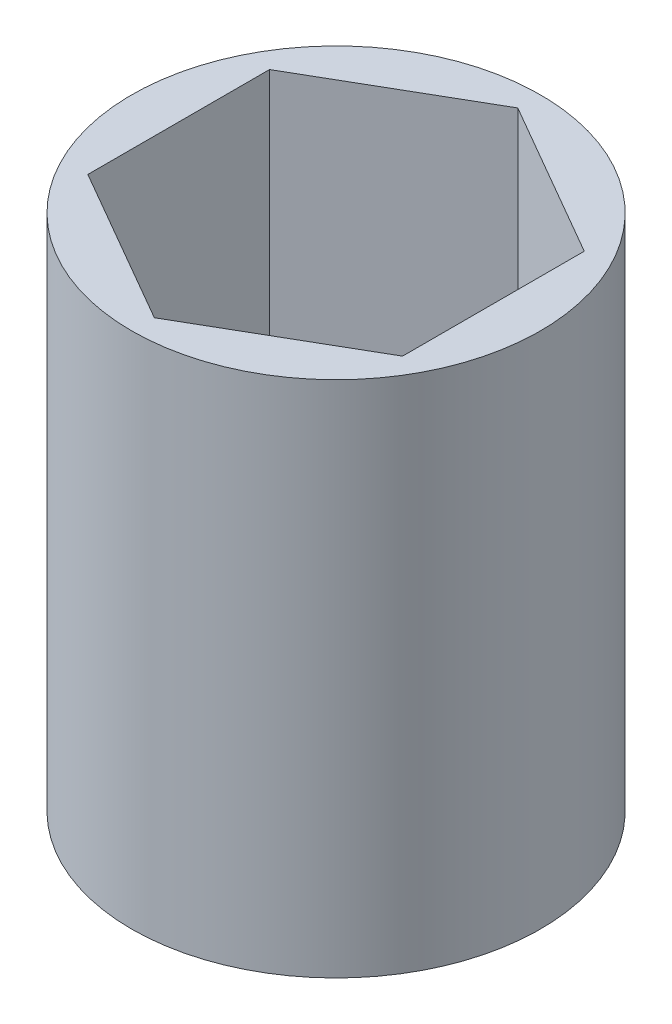
ISO-10303-21;
HEADER;
FILE_DESCRIPTION(('STEP AP214'),'2;1');
FILE_NAME('part.step','',(''),(''),'','','');
FILE_SCHEMA(('AUTOMOTIVE_DESIGN { 1 0 10303 214 1 1 1 1 }'));
ENDSEC;
DATA;
#1=APPLICATION_CONTEXT('core data for automotive mechanical design processes');
#2=APPLICATION_PROTOCOL_DEFINITION('international standard','automotive_design',2000,#1);
#3=PRODUCT_CONTEXT('',#1,'mechanical');
#4=PRODUCT('Part','Part','',(#3));
#5=PRODUCT_RELATED_PRODUCT_CATEGORY('part','',(#4));
#6=PRODUCT_DEFINITION_FORMATION('','',#4);
#7=PRODUCT_DEFINITION_CONTEXT('part definition',#1,'design');
#8=PRODUCT_DEFINITION('design','',#6,#7);
#9=PRODUCT_DEFINITION_SHAPE('','',#8);
#10=(LENGTH_UNIT() NAMED_UNIT(*) SI_UNIT(.MILLI.,.METRE.));
#11=(NAMED_UNIT(*) PLANE_ANGLE_UNIT() SI_UNIT($,.RADIAN.));
#12=(NAMED_UNIT(*) SI_UNIT($,.STERADIAN.) SOLID_ANGLE_UNIT());
#13=UNCERTAINTY_MEASURE_WITH_UNIT(LENGTH_MEASURE(1.E-05),#10,'distance_accuracy_value','');
#14=(GEOMETRIC_REPRESENTATION_CONTEXT(3) GLOBAL_UNCERTAINTY_ASSIGNED_CONTEXT((#13)) GLOBAL_UNIT_ASSIGNED_CONTEXT((#10,
#11,#12)) REPRESENTATION_CONTEXT('',''));
#15=CARTESIAN_POINT('',(0.,0.,0.));
#16=DIRECTION('',(0.,0.,1.));
#17=DIRECTION('',(1.,0.,0.));
#18=AXIS2_PLACEMENT_3D('',#15,#16,#17);
#19=CARTESIAN_POINT('',(0.,22.225,0.));
#20=DIRECTION('',(0.,1.,0.));
#21=DIRECTION('',(0.,0.,1.));
#22=AXIS2_PLACEMENT_3D('',#19,#20,#21);
#23=PLANE('',#22);
#24=CARTESIAN_POINT('',(0.,22.225,0.));
#25=DIRECTION('',(0.,1.,0.));
#26=DIRECTION('',(0.,0.,1.));
#27=AXIS2_PLACEMENT_3D('',#24,#25,#26);
#28=CIRCLE('',#27,8.76881679389313);
#29=CARTESIAN_POINT('',(0.,22.225,8.76881679389313));
#30=VERTEX_POINT('',#29);
#31=EDGE_CURVE('E11',#30,#30,#28,.T.);
#32=ORIENTED_EDGE('',*,*,#31,.T.);
#33=EDGE_LOOP('',(#32));
#34=FACE_BOUND('',#33,.T.);
#35=DIRECTION('',(-0.866025403784439,0.,0.5));
#36=VECTOR('',#35,1.);
#37=CARTESIAN_POINT('',(0.,22.225,-7.79422863405995));
#38=LINE('',#37,#36);
#39=CARTESIAN_POINT('',(0.,22.225,-7.79422863405995));
#40=VERTEX_POINT('',#39);
#41=CARTESIAN_POINT('',(-6.75,22.225,-3.89711431702997));
#42=VERTEX_POINT('',#41);
#43=EDGE_CURVE('E94',#40,#42,#38,.T.);
#44=ORIENTED_EDGE('',*,*,#43,.F.);
#45=DIRECTION('',(-0.866025403784439,0.,-0.5));
#46=VECTOR('',#45,1.);
#47=CARTESIAN_POINT('',(6.75,22.225,-3.89711431702997));
#48=LINE('',#47,#46);
#49=CARTESIAN_POINT('',(6.75,22.225,-3.89711431702997));
#50=VERTEX_POINT('',#49);
#51=EDGE_CURVE('E86',#50,#40,#48,.T.);
#52=ORIENTED_EDGE('',*,*,#51,.F.);
#53=DIRECTION('',(0.,0.,-1.));
#54=VECTOR('',#53,1.);
#55=CARTESIAN_POINT('',(6.75,22.225,3.89711431702997));
#56=LINE('',#55,#54);
#57=CARTESIAN_POINT('',(6.75,22.225,3.89711431702997));
#58=VERTEX_POINT('',#57);
#59=EDGE_CURVE('E114',#58,#50,#56,.T.);
#60=ORIENTED_EDGE('',*,*,#59,.F.);
#61=DIRECTION('',(0.866025403784439,0.,-0.5));
#62=VECTOR('',#61,1.);
#63=CARTESIAN_POINT('',(0.,22.225,7.79422863405995));
#64=LINE('',#63,#62);
#65=CARTESIAN_POINT('',(0.,22.225,7.79422863405995));
#66=VERTEX_POINT('',#65);
#67=EDGE_CURVE('E112',#66,#58,#64,.T.);
#68=ORIENTED_EDGE('',*,*,#67,.F.);
#69=DIRECTION('',(0.866025403784439,0.,0.5));
#70=VECTOR('',#69,1.);
#71=CARTESIAN_POINT('',(-6.75,22.225,3.89711431702997));
#72=LINE('',#71,#70);
#73=CARTESIAN_POINT('',(-6.75,22.225,3.89711431702997));
#74=VERTEX_POINT('',#73);
#75=EDGE_CURVE('E108',#74,#66,#72,.T.);
#76=ORIENTED_EDGE('',*,*,#75,.F.);
#77=DIRECTION('',(0.,0.,1.));
#78=VECTOR('',#77,1.);
#79=CARTESIAN_POINT('',(-6.75,22.225,-3.89711431702997));
#80=LINE('',#79,#78);
#81=EDGE_CURVE('E106',#42,#74,#80,.T.);
#82=ORIENTED_EDGE('',*,*,#81,.F.);
#83=EDGE_LOOP('',(#44,#52,#60,#68,#76,#82));
#84=FACE_BOUND('',#83,.T.);
#85=ADVANCED_FACE('F33',(#34,#84),#23,.T.);
#86=CARTESIAN_POINT('',(0.,0.,0.));
#87=DIRECTION('',(0.,1.,0.));
#88=DIRECTION('',(0.,0.,1.));
#89=AXIS2_PLACEMENT_3D('',#86,#87,#88);
#90=PLANE('',#89);
#91=CARTESIAN_POINT('',(0.,0.,0.));
#92=DIRECTION('',(0.,1.,0.));
#93=DIRECTION('',(0.,0.,1.));
#94=AXIS2_PLACEMENT_3D('',#91,#92,#93);
#95=CIRCLE('',#94,8.76881679389313);
#96=CARTESIAN_POINT('',(0.,0.,8.76881679389313));
#97=VERTEX_POINT('',#96);
#98=EDGE_CURVE('E37',#97,#97,#95,.T.);
#99=ORIENTED_EDGE('',*,*,#98,.F.);
#100=EDGE_LOOP('',(#99));
#101=FACE_BOUND('',#100,.T.);
#102=DIRECTION('',(-0.866025403784439,0.,-0.5));
#103=VECTOR('',#102,1.);
#104=CARTESIAN_POINT('',(6.75,0.,-3.89711431702997));
#105=LINE('',#104,#103);
#106=CARTESIAN_POINT('',(6.75,0.,-3.89711431702997));
#107=VERTEX_POINT('',#106);
#108=CARTESIAN_POINT('',(0.,0.,-7.79422863405995));
#109=VERTEX_POINT('',#108);
#110=EDGE_CURVE('E56',#107,#109,#105,.T.);
#111=ORIENTED_EDGE('',*,*,#110,.T.);
#112=DIRECTION('',(-0.866025403784439,0.,0.5));
#113=VECTOR('',#112,1.);
#114=CARTESIAN_POINT('',(0.,0.,-7.79422863405995));
#115=LINE('',#114,#113);
#116=CARTESIAN_POINT('',(-6.75,0.,-3.89711431702997));
#117=VERTEX_POINT('',#116);
#118=EDGE_CURVE('E101',#109,#117,#115,.T.);
#119=ORIENTED_EDGE('',*,*,#118,.T.);
#120=DIRECTION('',(0.,0.,1.));
#121=VECTOR('',#120,1.);
#122=CARTESIAN_POINT('',(-6.75,0.,-3.89711431702997));
#123=LINE('',#122,#121);
#124=CARTESIAN_POINT('',(-6.75,0.,3.89711431702997));
#125=VERTEX_POINT('',#124);
#126=EDGE_CURVE('E118',#117,#125,#123,.T.);
#127=ORIENTED_EDGE('',*,*,#126,.T.);
#128=DIRECTION('',(0.866025403784439,0.,0.5));
#129=VECTOR('',#128,1.);
#130=CARTESIAN_POINT('',(-6.75,0.,3.89711431702997));
#131=LINE('',#130,#129);
#132=CARTESIAN_POINT('',(0.,0.,7.79422863405995));
#133=VERTEX_POINT('',#132);
#134=EDGE_CURVE('E121',#125,#133,#131,.T.);
#135=ORIENTED_EDGE('',*,*,#134,.T.);
#136=DIRECTION('',(0.866025403784439,0.,-0.5));
#137=VECTOR('',#136,1.);
#138=CARTESIAN_POINT('',(0.,0.,7.79422863405995));
#139=LINE('',#138,#137);
#140=CARTESIAN_POINT('',(6.75,0.,3.89711431702997));
#141=VERTEX_POINT('',#140);
#142=EDGE_CURVE('E124',#133,#141,#139,.T.);
#143=ORIENTED_EDGE('',*,*,#142,.T.);
#144=DIRECTION('',(0.,0.,-1.));
#145=VECTOR('',#144,1.);
#146=CARTESIAN_POINT('',(6.75,0.,3.89711431702997));
#147=LINE('',#146,#145);
#148=EDGE_CURVE('E95',#141,#107,#147,.T.);
#149=ORIENTED_EDGE('',*,*,#148,.T.);
#150=EDGE_LOOP('',(#111,#119,#127,#135,#143,#149));
#151=FACE_BOUND('',#150,.T.);
#152=ADVANCED_FACE('F141',(#101,#151),#90,.F.);
#153=CARTESIAN_POINT('',(0.,22.225,0.));
#154=DIRECTION('',(0.,-1.,0.));
#155=DIRECTION('',(0.,0.,-1.));
#156=AXIS2_PLACEMENT_3D('',#153,#154,#155);
#157=CYLINDRICAL_SURFACE('',#156,8.76881679389313);
#158=ORIENTED_EDGE('',*,*,#31,.F.);
#159=EDGE_LOOP('',(#158));
#160=FACE_BOUND('',#159,.T.);
#161=ORIENTED_EDGE('',*,*,#98,.T.);
#162=EDGE_LOOP('',(#161));
#163=FACE_BOUND('',#162,.T.);
#164=ADVANCED_FACE('F35',(#160,#163),#157,.T.);
#165=CARTESIAN_POINT('',(6.75,22.225,-3.89711431702997));
#166=DIRECTION('',(-0.5,0.,0.866025403784438));
#167=DIRECTION('',(0.866025403784439,0.,0.5));
#168=AXIS2_PLACEMENT_3D('',#165,#166,#167);
#169=PLANE('',#168);
#170=ORIENTED_EDGE('',*,*,#110,.F.);
#171=DIRECTION('',(0.,-1.,0.));
#172=VECTOR('',#171,1.);
#173=CARTESIAN_POINT('',(6.75,22.225,-3.89711431702997));
#174=LINE('',#173,#172);
#175=EDGE_CURVE('E90',#50,#107,#174,.T.);
#176=ORIENTED_EDGE('',*,*,#175,.F.);
#177=ORIENTED_EDGE('',*,*,#51,.T.);
#178=DIRECTION('',(0.,-1.,0.));
#179=VECTOR('',#178,1.);
#180=CARTESIAN_POINT('',(0.,22.225,-7.79422863405995));
#181=LINE('',#180,#179);
#182=EDGE_CURVE('E89',#40,#109,#181,.T.);
#183=ORIENTED_EDGE('',*,*,#182,.T.);
#184=EDGE_LOOP('',(#170,#176,#177,#183));
#185=FACE_BOUND('',#184,.T.);
#186=ADVANCED_FACE('F88',(#185),#169,.T.);
#187=CARTESIAN_POINT('',(0.,22.225,-7.79422863405995));
#188=DIRECTION('',(0.5,0.,0.866025403784439));
#189=DIRECTION('',(0.866025403784439,0.,-0.5));
#190=AXIS2_PLACEMENT_3D('',#187,#188,#189);
#191=PLANE('',#190);
#192=ORIENTED_EDGE('',*,*,#118,.F.);
#193=ORIENTED_EDGE('',*,*,#182,.F.);
#194=ORIENTED_EDGE('',*,*,#43,.T.);
#195=DIRECTION('',(0.,-1.,0.));
#196=VECTOR('',#195,1.);
#197=CARTESIAN_POINT('',(-6.75,22.225,-3.89711431702997));
#198=LINE('',#197,#196);
#199=EDGE_CURVE('E102',#42,#117,#198,.T.);
#200=ORIENTED_EDGE('',*,*,#199,.T.);
#201=EDGE_LOOP('',(#192,#193,#194,#200));
#202=FACE_BOUND('',#201,.T.);
#203=ADVANCED_FACE('F98',(#202),#191,.T.);
#204=CARTESIAN_POINT('',(-6.75,22.225,-3.89711431702997));
#205=DIRECTION('',(1.,0.,0.));
#206=DIRECTION('',(0.,0.,-1.));
#207=AXIS2_PLACEMENT_3D('',#204,#205,#206);
#208=PLANE('',#207);
#209=ORIENTED_EDGE('',*,*,#126,.F.);
#210=ORIENTED_EDGE('',*,*,#199,.F.);
#211=ORIENTED_EDGE('',*,*,#81,.T.);
#212=DIRECTION('',(0.,-1.,0.));
#213=VECTOR('',#212,1.);
#214=CARTESIAN_POINT('',(-6.75,22.225,3.89711431702997));
#215=LINE('',#214,#213);
#216=EDGE_CURVE('E133',#74,#125,#215,.T.);
#217=ORIENTED_EDGE('',*,*,#216,.T.);
#218=EDGE_LOOP('',(#209,#210,#211,#217));
#219=FACE_BOUND('',#218,.T.);
#220=ADVANCED_FACE('F137',(#219),#208,.T.);
#221=CARTESIAN_POINT('',(-6.75,22.225,3.89711431702997));
#222=DIRECTION('',(0.5,0.,-0.866025403784438));
#223=DIRECTION('',(-0.866025403784439,0.,-0.5));
#224=AXIS2_PLACEMENT_3D('',#221,#222,#223);
#225=PLANE('',#224);
#226=ORIENTED_EDGE('',*,*,#134,.F.);
#227=ORIENTED_EDGE('',*,*,#216,.F.);
#228=ORIENTED_EDGE('',*,*,#75,.T.);
#229=DIRECTION('',(0.,-1.,0.));
#230=VECTOR('',#229,1.);
#231=CARTESIAN_POINT('',(0.,22.225,7.79422863405995));
#232=LINE('',#231,#230);
#233=EDGE_CURVE('E131',#66,#133,#232,.T.);
#234=ORIENTED_EDGE('',*,*,#233,.T.);
#235=EDGE_LOOP('',(#226,#227,#228,#234));
#236=FACE_BOUND('',#235,.T.);
#237=ADVANCED_FACE('F149',(#236),#225,.T.);
#238=CARTESIAN_POINT('',(0.,22.225,7.79422863405995));
#239=DIRECTION('',(-0.5,0.,-0.866025403784438));
#240=DIRECTION('',(-0.866025403784439,0.,0.5));
#241=AXIS2_PLACEMENT_3D('',#238,#239,#240);
#242=PLANE('',#241);
#243=ORIENTED_EDGE('',*,*,#142,.F.);
#244=ORIENTED_EDGE('',*,*,#233,.F.);
#245=ORIENTED_EDGE('',*,*,#67,.T.);
#246=DIRECTION('',(0.,-1.,0.));
#247=VECTOR('',#246,1.);
#248=CARTESIAN_POINT('',(6.75,22.225,3.89711431702997));
#249=LINE('',#248,#247);
#250=EDGE_CURVE('E48',#58,#141,#249,.T.);
#251=ORIENTED_EDGE('',*,*,#250,.T.);
#252=EDGE_LOOP('',(#243,#244,#245,#251));
#253=FACE_BOUND('',#252,.T.);
#254=ADVANCED_FACE('F147',(#253),#242,.T.);
#255=CARTESIAN_POINT('',(6.75,22.225,3.89711431702997));
#256=DIRECTION('',(-1.,0.,0.));
#257=DIRECTION('',(0.,0.,1.));
#258=AXIS2_PLACEMENT_3D('',#255,#256,#257);
#259=PLANE('',#258);
#260=ORIENTED_EDGE('',*,*,#148,.F.);
#261=ORIENTED_EDGE('',*,*,#250,.F.);
#262=ORIENTED_EDGE('',*,*,#59,.T.);
#263=ORIENTED_EDGE('',*,*,#175,.T.);
#264=EDGE_LOOP('',(#260,#261,#262,#263));
#265=FACE_BOUND('',#264,.T.);
#266=ADVANCED_FACE('F143',(#265),#259,.T.);
#267=CLOSED_SHELL('',(#85,#152,#164,#186,#203,#220,#237,#254,#266));
#268=MANIFOLD_SOLID_BREP('B2',#267);
#269=ADVANCED_BREP_SHAPE_REPRESENTATION('',(#18,#268),#14);
#270=SHAPE_DEFINITION_REPRESENTATION(#9,#269);
ENDSEC;
END-ISO-10303-21;
